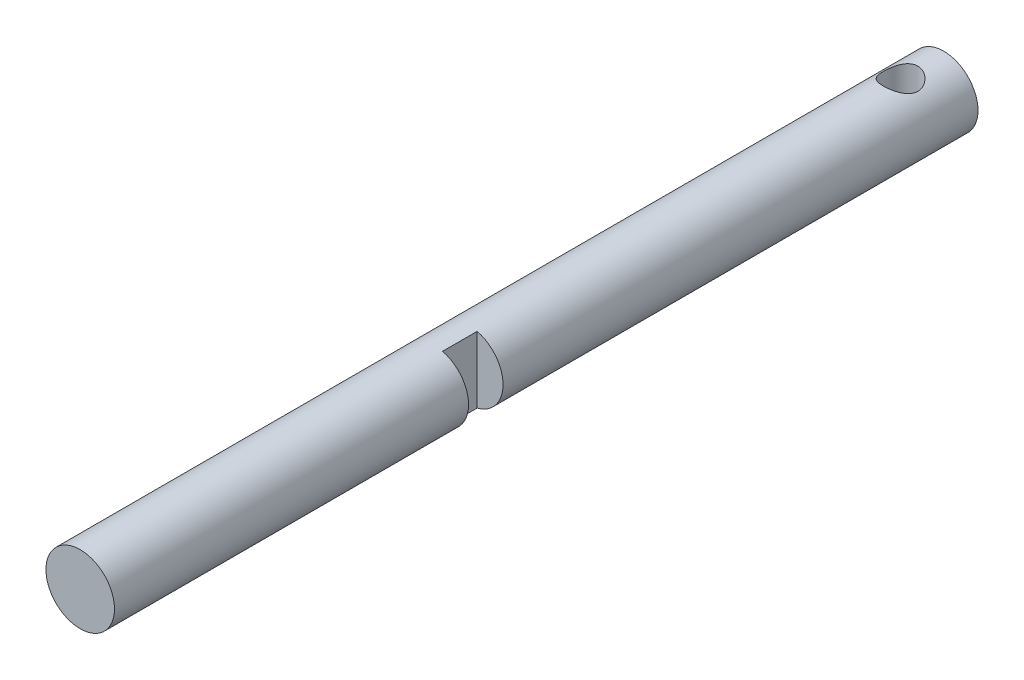
ISO-10303-21;
HEADER;
FILE_DESCRIPTION(('STEP AP214'),'2;1');
FILE_NAME('part.step','',(''),(''),'','','');
FILE_SCHEMA(('AUTOMOTIVE_DESIGN { 1 0 10303 214 1 1 1 1 }'));
ENDSEC;
DATA;
#1=APPLICATION_CONTEXT('core data for automotive mechanical design processes');
#2=APPLICATION_PROTOCOL_DEFINITION('international standard','automotive_design',2000,#1);
#3=PRODUCT_CONTEXT('',#1,'mechanical');
#4=PRODUCT('Part','Part','',(#3));
#5=PRODUCT_RELATED_PRODUCT_CATEGORY('part','',(#4));
#6=PRODUCT_DEFINITION_FORMATION('','',#4);
#7=PRODUCT_DEFINITION_CONTEXT('part definition',#1,'design');
#8=PRODUCT_DEFINITION('design','',#6,#7);
#9=PRODUCT_DEFINITION_SHAPE('','',#8);
#10=(LENGTH_UNIT() NAMED_UNIT(*) SI_UNIT(.MILLI.,.METRE.));
#11=(NAMED_UNIT(*) PLANE_ANGLE_UNIT() SI_UNIT($,.RADIAN.));
#12=(NAMED_UNIT(*) SI_UNIT($,.STERADIAN.) SOLID_ANGLE_UNIT());
#13=UNCERTAINTY_MEASURE_WITH_UNIT(LENGTH_MEASURE(1.E-05),#10,'distance_accuracy_value','');
#14=(GEOMETRIC_REPRESENTATION_CONTEXT(3) GLOBAL_UNCERTAINTY_ASSIGNED_CONTEXT((#13)) GLOBAL_UNIT_ASSIGNED_CONTEXT((#10,
#11,#12)) REPRESENTATION_CONTEXT('',''));
#15=CARTESIAN_POINT('',(0.,0.,0.));
#16=DIRECTION('',(0.,0.,1.));
#17=DIRECTION('',(1.,0.,0.));
#18=AXIS2_PLACEMENT_3D('',#15,#16,#17);
#19=CARTESIAN_POINT('',(0.,0.,100.));
#20=DIRECTION('',(0.,0.,-1.));
#21=DIRECTION('',(-1.,0.,0.));
#22=AXIS2_PLACEMENT_3D('',#19,#20,#21);
#23=CYLINDRICAL_SURFACE('',#22,3.96875);
#24=CARTESIAN_POINT('',(0.,0.,59.));
#25=DIRECTION('',(0.,0.,1.));
#26=DIRECTION('',(1.,0.,0.));
#27=AXIS2_PLACEMENT_3D('',#24,#25,#26);
#28=CIRCLE('',#27,3.96875);
#29=CARTESIAN_POINT('',(0.968750000000002,-3.84870107958516,59.));
#30=VERTEX_POINT('',#29);
#31=CARTESIAN_POINT('',(0.968750000000002,3.84870107958516,59.));
#32=VERTEX_POINT('',#31);
#33=EDGE_CURVE('E11',#30,#32,#28,.T.);
#34=ORIENTED_EDGE('',*,*,#33,.T.);
#35=DIRECTION('',(0.,0.,-1.));
#36=VECTOR('',#35,1.);
#37=CARTESIAN_POINT('',(0.968750000000002,3.84870107958516,100.));
#38=LINE('',#37,#36);
#39=CARTESIAN_POINT('',(0.968750000000002,3.84870107958516,55.));
#40=VERTEX_POINT('',#39);
#41=EDGE_CURVE('E41',#32,#40,#38,.T.);
#42=ORIENTED_EDGE('',*,*,#41,.T.);
#43=CARTESIAN_POINT('',(0.,0.,55.));
#44=DIRECTION('',(0.,0.,-1.));
#45=DIRECTION('',(-1.,0.,0.));
#46=AXIS2_PLACEMENT_3D('',#43,#44,#45);
#47=CIRCLE('',#46,3.96875);
#48=CARTESIAN_POINT('',(0.968750000000002,-3.84870107958516,55.));
#49=VERTEX_POINT('',#48);
#50=EDGE_CURVE('E59',#40,#49,#47,.T.);
#51=ORIENTED_EDGE('',*,*,#50,.T.);
#52=DIRECTION('',(0.,0.,-1.));
#53=VECTOR('',#52,1.);
#54=CARTESIAN_POINT('',(0.968750000000002,-3.84870107958516,100.));
#55=LINE('',#54,#53);
#56=EDGE_CURVE('E61',#49,#30,#55,.F.);
#57=ORIENTED_EDGE('',*,*,#56,.T.);
#58=EDGE_LOOP('',(#34,#42,#51,#57));
#59=FACE_BOUND('',#58,.T.);
#60=CARTESIAN_POINT('',(0.,-3.96875,7.));
#61=CARTESIAN_POINT('',(0.105044364393721,-3.96874419729155,6.99999333713274));
#62=CARTESIAN_POINT('',(0.210210974402365,-3.96453497935811,6.99167567635139));
#63=CARTESIAN_POINT('',(0.417429664287744,-3.94811145810414,6.95877586223906));
#64=CARTESIAN_POINT('',(0.519475583590153,-3.93588227142353,6.93416346853098));
#65=CARTESIAN_POINT('',(0.717140269253556,-3.90469727447898,6.86988455940273));
#66=CARTESIAN_POINT('',(0.812782447215145,-3.88576776031294,6.83027685287189));
#67=CARTESIAN_POINT('',(0.99591871485823,-3.8429130039039,6.73743951825256));
#68=CARTESIAN_POINT('',(1.08341336317836,-3.81898810453671,6.68421082503184));
#69=CARTESIAN_POINT('',(1.25379118998476,-3.76661728617937,6.56194285785201));
#70=CARTESIAN_POINT('',(1.33606489616438,-3.73798433745289,6.49213561774415));
#71=CARTESIAN_POINT('',(1.48829992726925,-3.68002547750164,6.34034798536173));
#72=CARTESIAN_POINT('',(1.55825171008775,-3.65069904900493,6.25835824873984));
#73=CARTESIAN_POINT('',(1.689408465032,-3.59199656346413,6.07675956250792));
#74=CARTESIAN_POINT('',(1.74948399843525,-3.56280004543902,5.97626995293447));
#75=CARTESIAN_POINT('',(1.85162829384994,-3.51080557578824,5.76499116874031));
#76=CARTESIAN_POINT('',(1.89371006462444,-3.4880030057161,5.654209505632));
#77=CARTESIAN_POINT('',(1.95591012941603,-3.45349058387265,5.43228802771367));
#78=CARTESIAN_POINT('',(1.97719913509074,-3.44119508578725,5.32157207519589));
#79=CARTESIAN_POINT('',(2.00078612899731,-3.4275412931455,5.09751419004311));
#80=CARTESIAN_POINT('',(2.00310342680187,-3.42617187796112,4.98417504520977));
#81=CARTESIAN_POINT('',(1.98953942771889,-3.43405536458094,4.77295611053339));
#82=CARTESIAN_POINT('',(1.97584306426692,-3.44203319545298,4.67487666307708));
#83=CARTESIAN_POINT('',(1.9344320366235,-3.46547394577963,4.48265752885685));
#84=CARTESIAN_POINT('',(1.90671278682338,-3.48093931365435,4.38851914176502));
#85=CARTESIAN_POINT('',(1.83754508289807,-3.51794913357268,4.20416478521445));
#86=CARTESIAN_POINT('',(1.79579233447353,-3.53962659633154,4.1140909492133));
#87=CARTESIAN_POINT('',(1.69997792112051,-3.58662743842013,3.94179220017232));
#88=CARTESIAN_POINT('',(1.64591072325596,-3.61195245472554,3.85957083892485));
#89=CARTESIAN_POINT('',(1.51886733646957,-3.66734383365036,3.69413828357273));
#90=CARTESIAN_POINT('',(1.44435126116665,-3.6976002664453,3.61216911121176));
#91=CARTESIAN_POINT('',(1.28251830579101,-3.75680035486893,3.46136845619967));
#92=CARTESIAN_POINT('',(1.19519515894541,-3.78574335867807,3.39254344343991));
#93=CARTESIAN_POINT('',(1.00493996001428,-3.84074545905969,3.26688284100554));
#94=CARTESIAN_POINT('',(0.901460874928112,-3.86660022667556,3.21077874353812));
#95=CARTESIAN_POINT('',(0.684901124322803,-3.91076191738939,3.1172387330466));
#96=CARTESIAN_POINT('',(0.571828281851466,-3.92907492027833,3.07978777767751));
#97=CARTESIAN_POINT('',(0.349435486164918,-3.95478667537539,3.02773589085866));
#98=CARTESIAN_POINT('',(0.240593423802708,-3.96297057983503,3.01148494128538));
#99=CARTESIAN_POINT('',(0.0214359424523995,-3.97020324166905,2.99710670750164));
#100=CARTESIAN_POINT('',(-0.0888787359965977,-3.96925642973855,2.9989706330217));
#101=CARTESIAN_POINT('',(-0.298578053832709,-3.95878581641227,3.01982982630585));
#102=CARTESIAN_POINT('',(-0.398137653227472,-3.94994555882255,3.03745998026807));
#103=CARTESIAN_POINT('',(-0.592680138242725,-3.9254710241732,3.08719744068776));
#104=CARTESIAN_POINT('',(-0.687662521578195,-3.9098360033614,3.11930633199671));
#105=CARTESIAN_POINT('',(-0.873467714242571,-3.87263057527675,3.19791202835465));
#106=CARTESIAN_POINT('',(-0.964097244439886,-3.85090498734869,3.24478962652486));
#107=CARTESIAN_POINT('',(-1.13649963643974,-3.80359689095849,3.35116972254074));
#108=CARTESIAN_POINT('',(-1.21826873082422,-3.77801275283046,3.41067755913715));
#109=CARTESIAN_POINT('',(-1.3792493492716,-3.72244527654937,3.5474480631637));
#110=CARTESIAN_POINT('',(-1.45739919569066,-3.69227742188393,3.62588745924246));
#111=CARTESIAN_POINT('',(-1.59991394555256,-3.6327988677818,3.79480325916907));
#112=CARTESIAN_POINT('',(-1.66426893928609,-3.60348879750974,3.88528824098126));
#113=CARTESIAN_POINT('',(-1.78043893366203,-3.54758837285724,4.08148321267558));
#114=CARTESIAN_POINT('',(-1.83145623879309,-3.52121020298927,4.18773140345638));
#115=CARTESIAN_POINT('',(-1.91434098652306,-3.47685448000142,4.40905683415404));
#116=CARTESIAN_POINT('',(-1.94623347494993,-3.45886594672346,4.52412230314535));
#117=CARTESIAN_POINT('',(-1.98699165054921,-3.43559928643525,4.74795403193015));
#118=CARTESIAN_POINT('',(-1.99778173797426,-3.42926249964522,4.85625730230581));
#119=CARTESIAN_POINT('',(-2.00159729859479,-3.42703924140209,5.0732633731144));
#120=CARTESIAN_POINT('',(-1.9946308883983,-3.43114799522371,5.18196596833091));
#121=CARTESIAN_POINT('',(-1.96493716594672,-3.44822230286761,5.38542164445662));
#122=CARTESIAN_POINT('',(-1.94382419587219,-3.46027881156843,5.48049656303766));
#123=CARTESIAN_POINT('',(-1.88845515414574,-3.49080320708906,5.66564260254213));
#124=CARTESIAN_POINT('',(-1.85419479995904,-3.509273182799,5.75571208207417));
#125=CARTESIAN_POINT('',(-1.77093768752542,-3.55205308471594,5.93498488790095));
#126=CARTESIAN_POINT('',(-1.72110662182647,-3.5766716289465,6.0237248863182));
#127=CARTESIAN_POINT('',(-1.60903249628035,-3.62847095830393,6.19216623569335));
#128=CARTESIAN_POINT('',(-1.54678292669128,-3.65565308329516,6.27186281159771));
#129=CARTESIAN_POINT('',(-1.40258185913217,-3.71355541811733,6.4302480445833));
#130=CARTESIAN_POINT('',(-1.31914386505357,-3.7442959411155,6.50758334340481));
#131=CARTESIAN_POINT('',(-1.13964139087186,-3.80277510206699,6.64747213325242));
#132=CARTESIAN_POINT('',(-1.04357001810246,-3.83051208614115,6.71001750251102));
#133=CARTESIAN_POINT('',(-0.840012195056437,-3.88026122701983,6.81873851870094));
#134=CARTESIAN_POINT('',(-0.732432368610937,-3.90222062517774,6.8647646156126));
#135=CARTESIAN_POINT('',(-0.509753551118405,-3.93747840296934,6.93746821795788));
#136=CARTESIAN_POINT('',(-0.394676808681793,-3.95080123058851,6.96420036434332));
#137=CARTESIAN_POINT('',(-0.231992557187336,-3.96223493210956,6.98704537576684));
#138=CARTESIAN_POINT('',(-0.185769933360153,-3.96467148594536,6.99189624832546));
#139=CARTESIAN_POINT('',(-0.0930395407529059,-3.9679303272778,6.99837508043252));
#140=CARTESIAN_POINT('',(-0.0465317641768104,-3.96875257044024,7.00000295146693));
#141=CARTESIAN_POINT('',(0.,-3.96875,7.));
#142=B_SPLINE_CURVE_WITH_KNOTS('',3,(#60,#61,#62,#63,#64,#65,#66,#67,#68,#69,#70,#71,#72,#73,
#74,#75,#76,#77,#78,#79,#80,#81,#82,#83,#84,#85,#86,#87,#88,#89,#90,#91,#92,#93,#94,#95,#96,#97,
#98,#99,#100,#101,#102,#103,#104,#105,#106,#107,#108,#109,#110,#111,#112,#113,#114,#115,#116,
#117,#118,#119,#120,#121,#122,#123,#124,#125,#126,#127,#128,#129,#130,#131,#132,#133,#134,#135,
#136,#137,#138,#139,#140,#141),.UNSPECIFIED.,.T.,.F.,(4,2,2,2,2,2,2,2,2,2,2,2,2,2,2,2,2,2,2,2,2,
2,2,2,2,2,2,2,2,2,2,2,2,2,2,2,2,2,2,2,4),(0.,0.314944418531739,0.630474967313316,
0.944780670342447,1.25906480698282,1.59257378517227,1.92633990827316,2.28650509520312,
2.64640945519232,2.98462592051644,3.32249810326929,3.61916529395571,3.91592956022466,
4.21959536780588,4.52339788386047,4.86641291848827,5.20959636115877,5.56920510369918,
5.92852337760683,6.25777015963487,6.58685718216363,6.88994434688684,7.19306469577361,
7.50474721721494,7.81656174891735,8.15936313724882,8.50240996215236,8.8627861383627,
9.22268932996371,9.54787669331505,9.87291543811398,10.166045951013,10.4592720273052,
10.7721663117442,11.0852250474413,11.4371476779989,11.7892631174823,12.144490331167,
12.4987075423346,12.6382154259009,12.7777271407512),.UNSPECIFIED.);
#143=CARTESIAN_POINT('',(0.,-3.96875,7.));
#144=VERTEX_POINT('',#143);
#145=EDGE_CURVE('E62',#144,#144,#142,.T.);
#146=ORIENTED_EDGE('',*,*,#145,.T.);
#147=EDGE_LOOP('',(#146));
#148=FACE_BOUND('',#147,.T.);
#149=CARTESIAN_POINT('',(0.,3.96875,7.));
#150=CARTESIAN_POINT('',(-0.105044364393721,3.96874419729155,6.99999333713274));
#151=CARTESIAN_POINT('',(-0.210210974402365,3.96453497935811,6.99167567635139));
#152=CARTESIAN_POINT('',(-0.417429664287744,3.94811145810414,6.95877586223906));
#153=CARTESIAN_POINT('',(-0.519475583590153,3.93588227142353,6.93416346853098));
#154=CARTESIAN_POINT('',(-0.717140269253556,3.90469727447898,6.86988455940273));
#155=CARTESIAN_POINT('',(-0.812782447215145,3.88576776031294,6.83027685287189));
#156=CARTESIAN_POINT('',(-0.99591871485823,3.8429130039039,6.73743951825256));
#157=CARTESIAN_POINT('',(-1.08341336317836,3.81898810453671,6.68421082503184));
#158=CARTESIAN_POINT('',(-1.25379118998476,3.76661728617937,6.56194285785201));
#159=CARTESIAN_POINT('',(-1.33606489616438,3.73798433745289,6.49213561774415));
#160=CARTESIAN_POINT('',(-1.48829992726925,3.68002547750164,6.34034798536173));
#161=CARTESIAN_POINT('',(-1.55825171008775,3.65069904900493,6.25835824873984));
#162=CARTESIAN_POINT('',(-1.689408465032,3.59199656346413,6.07675956250792));
#163=CARTESIAN_POINT('',(-1.74948399843525,3.56280004543902,5.97626995293447));
#164=CARTESIAN_POINT('',(-1.85162829384994,3.51080557578824,5.76499116874031));
#165=CARTESIAN_POINT('',(-1.89371006462444,3.4880030057161,5.654209505632));
#166=CARTESIAN_POINT('',(-1.95591012941603,3.45349058387265,5.43228802771367));
#167=CARTESIAN_POINT('',(-1.97719913509074,3.44119508578725,5.32157207519589));
#168=CARTESIAN_POINT('',(-2.00078612899731,3.4275412931455,5.09751419004311));
#169=CARTESIAN_POINT('',(-2.00310342680187,3.42617187796112,4.98417504520977));
#170=CARTESIAN_POINT('',(-1.98953942771889,3.43405536458094,4.77295611053339));
#171=CARTESIAN_POINT('',(-1.97584306426692,3.44203319545298,4.67487666307708));
#172=CARTESIAN_POINT('',(-1.9344320366235,3.46547394577963,4.48265752885685));
#173=CARTESIAN_POINT('',(-1.90671278682338,3.48093931365435,4.38851914176502));
#174=CARTESIAN_POINT('',(-1.83754508289807,3.51794913357268,4.20416478521445));
#175=CARTESIAN_POINT('',(-1.79579233447353,3.53962659633154,4.1140909492133));
#176=CARTESIAN_POINT('',(-1.69997792112051,3.58662743842013,3.94179220017232));
#177=CARTESIAN_POINT('',(-1.64591072325596,3.61195245472554,3.85957083892485));
#178=CARTESIAN_POINT('',(-1.51886733646957,3.66734383365036,3.69413828357273));
#179=CARTESIAN_POINT('',(-1.44435126116665,3.6976002664453,3.61216911121176));
#180=CARTESIAN_POINT('',(-1.28251830579101,3.75680035486893,3.46136845619967));
#181=CARTESIAN_POINT('',(-1.19519515894541,3.78574335867807,3.39254344343991));
#182=CARTESIAN_POINT('',(-1.00493996001428,3.84074545905969,3.26688284100554));
#183=CARTESIAN_POINT('',(-0.901460874928112,3.86660022667556,3.21077874353812));
#184=CARTESIAN_POINT('',(-0.684901124322803,3.91076191738939,3.1172387330466));
#185=CARTESIAN_POINT('',(-0.571828281851466,3.92907492027833,3.07978777767751));
#186=CARTESIAN_POINT('',(-0.349435486164918,3.95478667537539,3.02773589085866));
#187=CARTESIAN_POINT('',(-0.240593423802708,3.96297057983503,3.01148494128538));
#188=CARTESIAN_POINT('',(-0.0214359424523995,3.97020324166905,2.99710670750164));
#189=CARTESIAN_POINT('',(0.0888787359965977,3.96925642973855,2.9989706330217));
#190=CARTESIAN_POINT('',(0.298578053832709,3.95878581641227,3.01982982630585));
#191=CARTESIAN_POINT('',(0.398137653227472,3.94994555882255,3.03745998026807));
#192=CARTESIAN_POINT('',(0.592680138242725,3.9254710241732,3.08719744068776));
#193=CARTESIAN_POINT('',(0.687662521578195,3.9098360033614,3.11930633199671));
#194=CARTESIAN_POINT('',(0.873467714242571,3.87263057527675,3.19791202835465));
#195=CARTESIAN_POINT('',(0.964097244439886,3.85090498734869,3.24478962652486));
#196=CARTESIAN_POINT('',(1.13649963643974,3.80359689095849,3.35116972254074));
#197=CARTESIAN_POINT('',(1.21826873082422,3.77801275283046,3.41067755913715));
#198=CARTESIAN_POINT('',(1.3792493492716,3.72244527654937,3.5474480631637));
#199=CARTESIAN_POINT('',(1.45739919569066,3.69227742188393,3.62588745924246));
#200=CARTESIAN_POINT('',(1.59991394555256,3.6327988677818,3.79480325916907));
#201=CARTESIAN_POINT('',(1.66426893928609,3.60348879750974,3.88528824098126));
#202=CARTESIAN_POINT('',(1.78043893366203,3.54758837285724,4.08148321267558));
#203=CARTESIAN_POINT('',(1.83145623879309,3.52121020298927,4.18773140345638));
#204=CARTESIAN_POINT('',(1.91434098652306,3.47685448000142,4.40905683415404));
#205=CARTESIAN_POINT('',(1.94623347494993,3.45886594672346,4.52412230314535));
#206=CARTESIAN_POINT('',(1.98699165054921,3.43559928643525,4.74795403193015));
#207=CARTESIAN_POINT('',(1.99778173797426,3.42926249964522,4.85625730230581));
#208=CARTESIAN_POINT('',(2.00159729859479,3.42703924140209,5.0732633731144));
#209=CARTESIAN_POINT('',(1.9946308883983,3.43114799522371,5.18196596833091));
#210=CARTESIAN_POINT('',(1.96493716594672,3.44822230286761,5.38542164445662));
#211=CARTESIAN_POINT('',(1.94382419587219,3.46027881156843,5.48049656303766));
#212=CARTESIAN_POINT('',(1.88845515414574,3.49080320708906,5.66564260254213));
#213=CARTESIAN_POINT('',(1.85419479995904,3.509273182799,5.75571208207417));
#214=CARTESIAN_POINT('',(1.77093768752542,3.55205308471594,5.93498488790095));
#215=CARTESIAN_POINT('',(1.72110662182647,3.5766716289465,6.0237248863182));
#216=CARTESIAN_POINT('',(1.60903249628035,3.62847095830393,6.19216623569335));
#217=CARTESIAN_POINT('',(1.54678292669128,3.65565308329516,6.27186281159771));
#218=CARTESIAN_POINT('',(1.40258185913217,3.71355541811733,6.4302480445833));
#219=CARTESIAN_POINT('',(1.31914386505357,3.7442959411155,6.50758334340481));
#220=CARTESIAN_POINT('',(1.13964139087186,3.80277510206699,6.64747213325242));
#221=CARTESIAN_POINT('',(1.04357001810246,3.83051208614115,6.71001750251102));
#222=CARTESIAN_POINT('',(0.840012195056437,3.88026122701983,6.81873851870094));
#223=CARTESIAN_POINT('',(0.732432368610937,3.90222062517774,6.8647646156126));
#224=CARTESIAN_POINT('',(0.509753551118405,3.93747840296934,6.93746821795788));
#225=CARTESIAN_POINT('',(0.394676808681793,3.95080123058851,6.96420036434332));
#226=CARTESIAN_POINT('',(0.231992557187336,3.96223493210956,6.98704537576684));
#227=CARTESIAN_POINT('',(0.185769933360153,3.96467148594536,6.99189624832546));
#228=CARTESIAN_POINT('',(0.0930395407529059,3.9679303272778,6.99837508043252));
#229=CARTESIAN_POINT('',(0.0465317641768104,3.96875257044024,7.00000295146693));
#230=CARTESIAN_POINT('',(0.,3.96875,7.));
#231=B_SPLINE_CURVE_WITH_KNOTS('',3,(#149,#150,#151,#152,#153,#154,#155,#156,#157,#158,#159,
#160,#161,#162,#163,#164,#165,#166,#167,#168,#169,#170,#171,#172,#173,#174,#175,#176,#177,#178,
#179,#180,#181,#182,#183,#184,#185,#186,#187,#188,#189,#190,#191,#192,#193,#194,#195,#196,#197,
#198,#199,#200,#201,#202,#203,#204,#205,#206,#207,#208,#209,#210,#211,#212,#213,#214,#215,#216,
#217,#218,#219,#220,#221,#222,#223,#224,#225,#226,#227,#228,#229,#230),.UNSPECIFIED.,.T.,.F.,(4,
2,2,2,2,2,2,2,2,2,2,2,2,2,2,2,2,2,2,2,2,2,2,2,2,2,2,2,2,2,2,2,2,2,2,2,2,2,2,2,4),(0.,
0.314944418531739,0.630474967313316,0.944780670342447,1.25906480698282,1.59257378517227,
1.92633990827316,2.28650509520312,2.64640945519232,2.98462592051644,3.32249810326929,
3.61916529395571,3.91592956022466,4.21959536780588,4.52339788386047,4.86641291848827,
5.20959636115877,5.56920510369918,5.92852337760683,6.25777015963487,6.58685718216363,
6.88994434688684,7.19306469577361,7.50474721721494,7.81656174891735,8.15936313724882,
8.50240996215236,8.8627861383627,9.22268932996371,9.54787669331505,9.87291543811398,
10.166045951013,10.4592720273052,10.7721663117442,11.0852250474413,11.4371476779989,
11.7892631174823,12.144490331167,12.4987075423346,12.6382154259009,12.7777271407512),.UNSPECIFIED.);
#232=CARTESIAN_POINT('',(0.,3.96875,7.));
#233=VERTEX_POINT('',#232);
#234=EDGE_CURVE('E79',#233,#233,#231,.T.);
#235=ORIENTED_EDGE('',*,*,#234,.T.);
#236=EDGE_LOOP('',(#235));
#237=FACE_BOUND('',#236,.T.);
#238=CARTESIAN_POINT('',(0.,0.,100.));
#239=DIRECTION('',(0.,0.,1.));
#240=DIRECTION('',(1.,0.,0.));
#241=AXIS2_PLACEMENT_3D('',#238,#239,#240);
#242=CIRCLE('',#241,3.96875);
#243=CARTESIAN_POINT('',(3.96875,0.,100.));
#244=VERTEX_POINT('',#243);
#245=EDGE_CURVE('E149',#244,#244,#242,.T.);
#246=ORIENTED_EDGE('',*,*,#245,.F.);
#247=EDGE_LOOP('',(#246));
#248=FACE_BOUND('',#247,.T.);
#249=CARTESIAN_POINT('',(0.,0.,0.));
#250=DIRECTION('',(0.,0.,1.));
#251=DIRECTION('',(1.,0.,0.));
#252=AXIS2_PLACEMENT_3D('',#249,#250,#251);
#253=CIRCLE('',#252,3.96875);
#254=CARTESIAN_POINT('',(3.96875,0.,0.));
#255=VERTEX_POINT('',#254);
#256=EDGE_CURVE('E146',#255,#255,#253,.T.);
#257=ORIENTED_EDGE('',*,*,#256,.T.);
#258=EDGE_LOOP('',(#257));
#259=FACE_BOUND('',#258,.T.);
#260=ADVANCED_FACE('F33',(#59,#148,#237,#248,#259),#23,.T.);
#261=CARTESIAN_POINT('',(0.,0.,100.));
#262=DIRECTION('',(0.,0.,1.));
#263=DIRECTION('',(1.,0.,0.));
#264=AXIS2_PLACEMENT_3D('',#261,#262,#263);
#265=PLANE('',#264);
#266=ORIENTED_EDGE('',*,*,#245,.T.);
#267=EDGE_LOOP('',(#266));
#268=FACE_BOUND('',#267,.T.);
#269=ADVANCED_FACE('F93',(#268),#265,.T.);
#270=CARTESIAN_POINT('',(0.,0.,0.));
#271=DIRECTION('',(0.,0.,1.));
#272=DIRECTION('',(1.,0.,0.));
#273=AXIS2_PLACEMENT_3D('',#270,#271,#272);
#274=PLANE('',#273);
#275=ORIENTED_EDGE('',*,*,#256,.F.);
#276=EDGE_LOOP('',(#275));
#277=FACE_BOUND('',#276,.T.);
#278=ADVANCED_FACE('F90',(#277),#274,.F.);
#279=CARTESIAN_POINT('',(0.,-3.96875,5.));
#280=DIRECTION('',(0.,1.,0.));
#281=DIRECTION('',(0.,0.,1.));
#282=AXIS2_PLACEMENT_3D('',#279,#280,#281);
#283=CYLINDRICAL_SURFACE('',#282,2.);
#284=ORIENTED_EDGE('',*,*,#234,.F.);
#285=EDGE_LOOP('',(#284));
#286=FACE_BOUND('',#285,.T.);
#287=ORIENTED_EDGE('',*,*,#145,.F.);
#288=EDGE_LOOP('',(#287));
#289=FACE_BOUND('',#288,.T.);
#290=ADVANCED_FACE('F84',(#286,#289),#283,.F.);
#291=CARTESIAN_POINT('',(3.96875,-3.96875,59.));
#292=DIRECTION('',(0.,0.,1.));
#293=DIRECTION('',(1.,0.,0.));
#294=AXIS2_PLACEMENT_3D('',#291,#292,#293);
#295=PLANE('',#294);
#296=ORIENTED_EDGE('',*,*,#33,.F.);
#297=DIRECTION('',(0.,1.,0.));
#298=VECTOR('',#297,1.);
#299=CARTESIAN_POINT('',(0.968750000000002,-3.96875,59.));
#300=LINE('',#299,#298);
#301=EDGE_CURVE('E68',#30,#32,#300,.T.);
#302=ORIENTED_EDGE('',*,*,#301,.T.);
#303=EDGE_LOOP('',(#296,#302));
#304=FACE_BOUND('',#303,.T.);
#305=ADVANCED_FACE('F89',(#304),#295,.F.);
#306=CARTESIAN_POINT('',(0.968750000000002,-3.96875,59.));
#307=DIRECTION('',(-1.,0.,0.));
#308=DIRECTION('',(0.,0.,1.));
#309=AXIS2_PLACEMENT_3D('',#306,#307,#308);
#310=PLANE('',#309);
#311=ORIENTED_EDGE('',*,*,#301,.F.);
#312=ORIENTED_EDGE('',*,*,#56,.F.);
#313=DIRECTION('',(0.,1.,0.));
#314=VECTOR('',#313,1.);
#315=CARTESIAN_POINT('',(0.968750000000002,-3.96875,55.));
#316=LINE('',#315,#314);
#317=EDGE_CURVE('E47',#49,#40,#316,.T.);
#318=ORIENTED_EDGE('',*,*,#317,.T.);
#319=ORIENTED_EDGE('',*,*,#41,.F.);
#320=EDGE_LOOP('',(#311,#312,#318,#319));
#321=FACE_BOUND('',#320,.T.);
#322=ADVANCED_FACE('F66',(#321),#310,.F.);
#323=CARTESIAN_POINT('',(0.968750000000002,-3.96875,55.));
#324=DIRECTION('',(0.,0.,-1.));
#325=DIRECTION('',(-1.,0.,0.));
#326=AXIS2_PLACEMENT_3D('',#323,#324,#325);
#327=PLANE('',#326);
#328=ORIENTED_EDGE('',*,*,#317,.F.);
#329=ORIENTED_EDGE('',*,*,#50,.F.);
#330=EDGE_LOOP('',(#328,#329));
#331=FACE_BOUND('',#330,.T.);
#332=ADVANCED_FACE('F60',(#331),#327,.F.);
#333=CLOSED_SHELL('',(#260,#269,#278,#290,#305,#322,#332));
#334=MANIFOLD_SOLID_BREP('B2',#333);
#335=ADVANCED_BREP_SHAPE_REPRESENTATION('',(#18,#334),#14);
#336=SHAPE_DEFINITION_REPRESENTATION(#9,#335);
ENDSEC;
END-ISO-10303-21;
